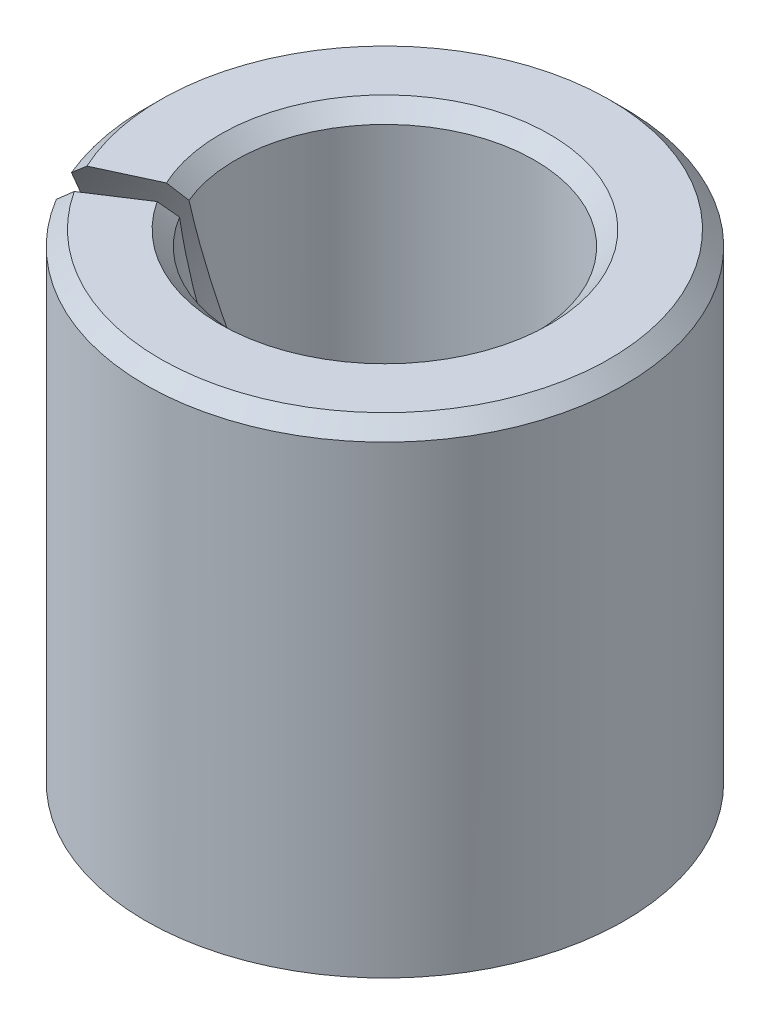
ISO-10303-21;
HEADER;
FILE_DESCRIPTION(('STEP AP214'),'2;1');
FILE_NAME('part.step','',(''),(''),'','','');
FILE_SCHEMA(('AUTOMOTIVE_DESIGN { 1 0 10303 214 1 1 1 1 }'));
ENDSEC;
DATA;
#1=APPLICATION_CONTEXT('core data for automotive mechanical design processes');
#2=APPLICATION_PROTOCOL_DEFINITION('international standard','automotive_design',2000,#1);
#3=PRODUCT_CONTEXT('',#1,'mechanical');
#4=PRODUCT('Part','Part','',(#3));
#5=PRODUCT_RELATED_PRODUCT_CATEGORY('part','',(#4));
#6=PRODUCT_DEFINITION_FORMATION('','',#4);
#7=PRODUCT_DEFINITION_CONTEXT('part definition',#1,'design');
#8=PRODUCT_DEFINITION('design','',#6,#7);
#9=PRODUCT_DEFINITION_SHAPE('','',#8);
#10=(LENGTH_UNIT() NAMED_UNIT(*) SI_UNIT(.MILLI.,.METRE.));
#11=(NAMED_UNIT(*) PLANE_ANGLE_UNIT() SI_UNIT($,.RADIAN.));
#12=(NAMED_UNIT(*) SI_UNIT($,.STERADIAN.) SOLID_ANGLE_UNIT());
#13=UNCERTAINTY_MEASURE_WITH_UNIT(LENGTH_MEASURE(1.E-05),#10,'distance_accuracy_value','');
#14=(GEOMETRIC_REPRESENTATION_CONTEXT(3) GLOBAL_UNCERTAINTY_ASSIGNED_CONTEXT((#13)) GLOBAL_UNIT_ASSIGNED_CONTEXT((#10,
#11,#12)) REPRESENTATION_CONTEXT('',''));
#15=CARTESIAN_POINT('',(0.,0.,0.));
#16=DIRECTION('',(0.,0.,1.));
#17=DIRECTION('',(1.,0.,0.));
#18=AXIS2_PLACEMENT_3D('',#15,#16,#17);
#19=CARTESIAN_POINT('',(0.,8.,0.));
#20=DIRECTION('',(0.,1.,0.));
#21=DIRECTION('',(0.,0.,1.));
#22=AXIS2_PLACEMENT_3D('',#19,#20,#21);
#23=PLANE('',#22);
#24=CARTESIAN_POINT('',(-3.35164731078001,8.,2.18322245869291));
#25=CARTESIAN_POINT('',(-0.837911827695003,8.,0.545805614673228));
#26=B_SPLINE_CURVE_WITH_KNOTS('',1,(#24,#25),.UNSPECIFIED.,.F.,.F.,(2,2),(0.,1.),.UNSPECIFIED.);
#27=CARTESIAN_POINT('',(-2.30425752616126,8.,1.50096544035138));
#28=VERTEX_POINT('',#27);
#29=CARTESIAN_POINT('',(-3.14216935385626,8.,2.04677105502461));
#30=VERTEX_POINT('',#29);
#31=EDGE_CURVE('E145',#28,#30,#26,.F.);
#32=ORIENTED_EDGE('',*,*,#31,.T.);
#33=CARTESIAN_POINT('',(0.,8.,0.));
#34=DIRECTION('',(0.,1.,0.));
#35=DIRECTION('',(0.,0.,1.));
#36=AXIS2_PLACEMENT_3D('',#33,#34,#35);
#37=CIRCLE('',#36,3.75);
#38=CARTESIAN_POINT('',(-3.40389644649981,8.,1.57352755981774));
#39=VERTEX_POINT('',#38);
#40=EDGE_CURVE('E252',#30,#39,#37,.T.);
#41=ORIENTED_EDGE('',*,*,#40,.T.);
#42=CARTESIAN_POINT('',(-0.907705719066615,8.,0.419607349284732));
#43=CARTESIAN_POINT('',(-3.63082287626646,8.,1.67842939713893));
#44=B_SPLINE_CURVE_WITH_KNOTS('',1,(#42,#43),.UNSPECIFIED.,.F.,.F.,(2,2),(0.,1.),.UNSPECIFIED.);
#45=CARTESIAN_POINT('',(-2.49619072743319,8.,1.15392021053301));
#46=VERTEX_POINT('',#45);
#47=EDGE_CURVE('E248',#46,#39,#44,.T.);
#48=ORIENTED_EDGE('',*,*,#47,.F.);
#49=CARTESIAN_POINT('',(0.,8.,0.));
#50=DIRECTION('',(0.,1.,0.));
#51=DIRECTION('',(0.,0.,1.));
#52=AXIS2_PLACEMENT_3D('',#49,#50,#51);
#53=CIRCLE('',#52,2.75);
#54=EDGE_CURVE('E251',#46,#28,#53,.F.);
#55=ORIENTED_EDGE('',*,*,#54,.T.);
#56=EDGE_LOOP('',(#32,#41,#48,#55));
#57=FACE_BOUND('',#56,.T.);
#58=ADVANCED_FACE('F61',(#57),#23,.T.);
#59=CARTESIAN_POINT('',(0.,0.,0.));
#60=DIRECTION('',(0.,1.,0.));
#61=DIRECTION('',(0.,0.,1.));
#62=AXIS2_PLACEMENT_3D('',#59,#60,#61);
#63=PLANE('',#62);
#64=CARTESIAN_POINT('',(0.,0.,0.));
#65=DIRECTION('',(0.,1.,0.));
#66=DIRECTION('',(0.,0.,1.));
#67=AXIS2_PLACEMENT_3D('',#64,#65,#66);
#68=CIRCLE('',#67,2.5);
#69=CARTESIAN_POINT('',(-2.09477956923747,0.,-1.36451403668313));
#70=VERTEX_POINT('',#69);
#71=CARTESIAN_POINT('',(-1.87672931323036,0.,-1.65163164321283));
#72=VERTEX_POINT('',#71);
#73=EDGE_CURVE('E142',#70,#72,#68,.T.);
#74=ORIENTED_EDGE('',*,*,#73,.T.);
#75=CARTESIAN_POINT('',(-3.00276690116857,0.,-2.64261062914053));
#76=CARTESIAN_POINT('',(-0.750691725292143,0.,-0.660652657285132));
#77=B_SPLINE_CURVE_WITH_KNOTS('',1,(#75,#76),.UNSPECIFIED.,.F.,.F.,(2,2),(0.,1.),.UNSPECIFIED.);
#78=CARTESIAN_POINT('',(-3.00276690116857,0.,-2.64261062914053));
#79=VERTEX_POINT('',#78);
#80=EDGE_CURVE('E129',#72,#79,#77,.F.);
#81=ORIENTED_EDGE('',*,*,#80,.T.);
#82=CARTESIAN_POINT('',(0.,0.,0.));
#83=DIRECTION('',(0.,1.,0.));
#84=DIRECTION('',(0.,0.,1.));
#85=AXIS2_PLACEMENT_3D('',#82,#83,#84);
#86=CIRCLE('',#85,4.);
#87=CARTESIAN_POINT('',(-3.35164731077995,0.,-2.18322245869301));
#88=VERTEX_POINT('',#87);
#89=EDGE_CURVE('E136',#88,#79,#86,.T.);
#90=ORIENTED_EDGE('',*,*,#89,.F.);
#91=CARTESIAN_POINT('',(-0.837911827694987,0.,-0.545805614673252));
#92=CARTESIAN_POINT('',(-3.35164731077995,0.,-2.18322245869301));
#93=B_SPLINE_CURVE_WITH_KNOTS('',1,(#91,#92),.UNSPECIFIED.,.F.,.F.,(2,2),(0.,1.),.UNSPECIFIED.);
#94=EDGE_CURVE('E117',#70,#88,#93,.T.);
#95=ORIENTED_EDGE('',*,*,#94,.F.);
#96=EDGE_LOOP('',(#74,#81,#90,#95));
#97=FACE_BOUND('',#96,.T.);
#98=ADVANCED_FACE('F140',(#97),#63,.F.);
#99=CARTESIAN_POINT('',(0.,8.,0.));
#100=DIRECTION('',(0.,-1.,0.));
#101=DIRECTION('',(0.,0.,-1.));
#102=AXIS2_PLACEMENT_3D('',#99,#100,#101);
#103=CYLINDRICAL_SURFACE('',#102,4.);
#104=CARTESIAN_POINT('',(-3.63082287626646,8.,1.67842939713893));
#105=CARTESIAN_POINT('',(-3.95390409081417,6.66638875719981,0.979531566422076));
#106=CARTESIAN_POINT('',(-4.06913133140055,5.33333333333333,0.186447849027548));
#107=CARTESIAN_POINT('',(-3.84767991076001,2.66666666666667,-1.33714318490073));
#108=CARTESIAN_POINT('',(-3.511443556317,1.33361124280019,-2.06460742025553));
#109=CARTESIAN_POINT('',(-3.00276690116857,0.,-2.64261062914053));
#110=B_SPLINE_CURVE_WITH_KNOTS('',3,(#104,#105,#106,#107,#108,#109),.UNSPECIFIED.,.F.,.F.,(4,2,
4),(0.,0.5,1.),.UNSPECIFIED.);
#111=CARTESIAN_POINT('',(-3.68898134344338,7.74999727449896,1.54634180827853));
#112=VERTEX_POINT('',#111);
#113=EDGE_CURVE('E130',#112,#79,#110,.T.);
#114=ORIENTED_EDGE('',*,*,#113,.F.);
#115=CARTESIAN_POINT('',(0.,7.75,0.));
#116=DIRECTION('',(0.,1.,0.));
#117=DIRECTION('',(0.,0.,1.));
#118=AXIS2_PLACEMENT_3D('',#115,#116,#117);
#119=CIRCLE('',#118,4.);
#120=CARTESIAN_POINT('',(-3.42819937983607,7.74999964072157,2.06087490079202));
#121=VERTEX_POINT('',#120);
#122=EDGE_CURVE('E86',#112,#121,#119,.F.);
#123=ORIENTED_EDGE('',*,*,#122,.T.);
#124=CARTESIAN_POINT('',(-3.35164731077995,0.,-2.18322245869301));
#125=CARTESIAN_POINT('',(-3.77189624396996,1.33361124280019,-1.53806318911145));
#126=CARTESIAN_POINT('',(-3.99999999999999,2.66666666666667,-0.769800358919553));
#127=CARTESIAN_POINT('',(-4.00000000000001,5.33333333333333,0.769800358919441));
#128=CARTESIAN_POINT('',(-3.77189624397,6.66638875719981,1.53806318911134));
#129=CARTESIAN_POINT('',(-3.35164731078001,8.,2.18322245869291));
#130=B_SPLINE_CURVE_WITH_KNOTS('',3,(#124,#125,#126,#127,#128,#129),.UNSPECIFIED.,.F.,.F.,(4,2,
4),(0.,0.5,1.),.UNSPECIFIED.);
#131=EDGE_CURVE('E120',#88,#121,#130,.T.);
#132=ORIENTED_EDGE('',*,*,#131,.F.);
#133=ORIENTED_EDGE('',*,*,#89,.T.);
#134=EDGE_LOOP('',(#114,#123,#132,#133));
#135=FACE_BOUND('',#134,.T.);
#136=ADVANCED_FACE('F135',(#135),#103,.T.);
#137=CARTESIAN_POINT('',(0.,8.,0.));
#138=DIRECTION('',(0.,-1.,0.));
#139=DIRECTION('',(0.,0.,-1.));
#140=AXIS2_PLACEMENT_3D('',#137,#138,#139);
#141=CYLINDRICAL_SURFACE('',#140,2.5);
#142=CARTESIAN_POINT('',(-2.0947795692375,8.,1.36451403668308));
#143=CARTESIAN_POINT('',(-2.13347179879048,7.80356652144109,1.30512649417586));
#144=CARTESIAN_POINT('',(-2.16962311571061,7.60713145407747,1.24409292330248));
#145=CARTESIAN_POINT('',(-2.23661725477523,7.21426337951584,1.11917722608871));
#146=CARTESIAN_POINT('',(-2.26746011576004,7.01783037231328,1.05529512059447));
#147=CARTESIAN_POINT('',(-2.32360215913504,6.62503235946273,0.925146039305551));
#148=CARTESIAN_POINT('',(-2.34890313260462,6.42866735238332,0.85887984210905));
#149=CARTESIAN_POINT('',(-2.39378787923158,6.03594562568108,0.724433761287841));
#150=CARTESIAN_POINT('',(-2.4133716504838,5.83958890606105,0.656253877025438));
#151=CARTESIAN_POINT('',(-2.4633177761066,5.25047542796568,0.449595958062258));
#152=CARTESIAN_POINT('',(-2.48487465652168,4.85767732675557,0.30900032229986));
#153=CARTESIAN_POINT('',(-2.50387752929466,4.07204467027626,0.026188622695644));
#154=CARTESIAN_POINT('',(-2.50132092214377,3.67921011564217,-0.116027614201374));
#155=CARTESIAN_POINT('',(-2.47660302648175,3.01264415277902,-0.35525504392761));
#156=CARTESIAN_POINT('',(-2.4606180958924,2.73889822513671,-0.452903883422451));
#157=CARTESIAN_POINT('',(-2.4172040175585,2.19139317228649,-0.64566401592916));
#158=CARTESIAN_POINT('',(-2.38977413216883,1.91763404736533,-0.740775144961189));
#159=CARTESIAN_POINT('',(-2.32383215830161,1.36989349168112,-0.927132446653661));
#160=CARTESIAN_POINT('',(-2.28531136574192,1.09591205550952,-1.01837551891094));
#161=CARTESIAN_POINT('',(-2.19777353235584,0.547954199173697,-1.19565921328491));
#162=CARTESIAN_POINT('',(-2.1487568676172,0.273977779181426,-1.28170002166732));
#163=CARTESIAN_POINT('',(-2.09477956923747,0.,-1.36451403668313));
#164=B_SPLINE_CURVE_WITH_KNOTS('',3,(#142,#143,#144,#145,#146,#147,#148,#149,#150,#151,#152,
#153,#154,#155,#156,#157,#158,#159,#160,#161,#162,#163),.UNSPECIFIED.,.F.,.F.,(4,2,2,2,2,2,2,2,
2,2,4),(0.,0.626466994763436,1.25292940566824,1.8791890508341,2.50544890468958,3.75797491757595,
5.01063595819591,5.88365662154139,6.75673356111809,7.6304975630143,8.50423026146536),.UNSPECIFIED.);
#165=CARTESIAN_POINT('',(-2.14264116350322,7.75,1.28805622721276));
#166=VERTEX_POINT('',#165);
#167=EDGE_CURVE('E123',#166,#70,#164,.T.);
#168=ORIENTED_EDGE('',*,*,#167,.F.);
#169=CARTESIAN_POINT('',(0.,7.75,0.));
#170=DIRECTION('',(0.,1.,0.));
#171=DIRECTION('',(0.,0.,1.));
#172=AXIS2_PLACEMENT_3D('',#169,#170,#171);
#173=CIRCLE('',#172,2.5);
#174=CARTESIAN_POINT('',(-2.30563074301679,7.75,0.966471353355011));
#175=VERTEX_POINT('',#174);
#176=EDGE_CURVE('E13',#166,#175,#173,.T.);
#177=ORIENTED_EDGE('',*,*,#176,.T.);
#178=CARTESIAN_POINT('',(-1.87672931323035,0.,-1.65163164321291));
#179=CARTESIAN_POINT('',(-1.92356131899051,0.196433478558899,-1.59842701870233));
#180=CARTESIAN_POINT('',(-1.96811559368399,0.392868545922516,-1.54322800516808));
#181=CARTESIAN_POINT('',(-2.05238057661736,0.78573662048414,-1.42924748608409));
#182=CARTESIAN_POINT('',(-2.09209132029522,0.982169627686704,-1.37046600675041));
#183=CARTESIAN_POINT('',(-2.16636980791478,1.37496764053726,-1.24974559144454));
#184=CARTESIAN_POINT('',(-2.20093921231998,1.57133264761667,-1.18780768359754));
#185=CARTESIAN_POINT('',(-2.26469553042314,1.9640543743189,-1.06121573665825));
#186=CARTESIAN_POINT('',(-2.29388244232746,2.16041109393894,-0.996561696660875));
#187=CARTESIAN_POINT('',(-2.37303423636561,2.7495245720343,-0.799236826369612));
#188=CARTESIAN_POINT('',(-2.4145897983071,3.14232267324441,-0.663203862863005));
#189=CARTESIAN_POINT('',(-2.47407383086553,3.92795532972372,-0.386066322141364));
#190=CARTESIAN_POINT('',(-2.49199975389665,4.32078988435781,-0.244961199765332));
#191=CARTESIAN_POINT('',(-2.50194862556406,4.98735584722096,-0.0046660532227408));
#192=CARTESIAN_POINT('',(-2.50017542380971,5.26110177486328,0.094266598698524));
#193=CARTESIAN_POINT('',(-2.4849388140592,5.8086068277135,0.291266843888466));
#194=CARTESIAN_POINT('',(-2.47147465250205,6.08236595263466,0.389334380983062));
#195=CARTESIAN_POINT('',(-2.43302344222969,6.63010650831887,0.583238718841184));
#196=CARTESIAN_POINT('',(-2.40802733399015,6.90408794449047,0.679073703409717));
#197=CARTESIAN_POINT('',(-2.34689971108731,7.4520458008263,0.867105068567393));
#198=CARTESIAN_POINT('',(-2.31076859539285,7.72602222081857,0.959301579390057));
#199=CARTESIAN_POINT('',(-2.26926429766654,8.,1.04901837321183));
#200=B_SPLINE_CURVE_WITH_KNOTS('',3,(#178,#179,#180,#181,#182,#183,#184,#185,#186,#187,#188,
#189,#190,#191,#192,#193,#194,#195,#196,#197,#198,#199),.UNSPECIFIED.,.F.,.F.,(4,2,2,2,2,2,2,2,
2,2,4),(0.,0.626466994763436,1.25292940566825,1.87918905083411,2.50544890468958,
3.75797491757595,5.01063595819591,5.8836566215414,6.75673356111811,7.63049756301431,
8.50423026146538),.UNSPECIFIED.);
#201=EDGE_CURVE('E143',#72,#175,#200,.T.);
#202=ORIENTED_EDGE('',*,*,#201,.F.);
#203=ORIENTED_EDGE('',*,*,#73,.F.);
#204=EDGE_LOOP('',(#168,#177,#202,#203));
#205=FACE_BOUND('',#204,.T.);
#206=ADVANCED_FACE('F159',(#205),#141,.F.);
#207=CARTESIAN_POINT('',(-3.35164731077995,0.,-2.18322245869301));
#208=CARTESIAN_POINT('',(-3.77189624396996,1.33361124280019,-1.53806318911145));
#209=CARTESIAN_POINT('',(-3.99999999999999,2.66666666666667,-0.769800358919553));
#210=CARTESIAN_POINT('',(-4.00000000000001,5.33333333333333,0.769800358919441));
#211=CARTESIAN_POINT('',(-3.77189624397,6.66638875719981,1.53806318911134));
#212=CARTESIAN_POINT('',(-3.35164731078001,8.,2.18322245869291));
#213=CARTESIAN_POINT('',(-0.837911827694987,0.,-0.545805614673252));
#214=CARTESIAN_POINT('',(-0.942953954461154,1.33335601982042,-0.384546664494995));
#215=CARTESIAN_POINT('',(-0.999999999999997,2.66666666666667,-0.192450089729888));
#216=CARTESIAN_POINT('',(-1.,5.33333333333333,0.19245008972986));
#217=CARTESIAN_POINT('',(-0.942953954461165,6.66664398017957,0.384546664494968));
#218=CARTESIAN_POINT('',(-0.837911827695003,8.,0.545805614673228));
#219=B_SPLINE_SURFACE_WITH_KNOTS('',1,3,((#207,#208,#209,#210,#211,#212),(#213,#214,#215,#216,
#217,#218)),.UNSPECIFIED.,.F.,.F.,.F.,(2,2),(4,2,4),(0.,1.),(0.,0.5,1.),.UNSPECIFIED.);
#220=CARTESIAN_POINT('',(-3.42822573173537,7.7499968609573,2.06089627216386));
#221=CARTESIAN_POINT('',(-3.38031686553513,7.79148275615796,2.06004793054373));
#222=CARTESIAN_POINT('',(-3.33252440094507,7.83305929867851,2.05844665830539));
#223=CARTESIAN_POINT('',(-3.23717227498537,7.91639367835941,2.05373825259231));
#224=CARTESIAN_POINT('',(-3.18961261361571,7.95815151551976,2.05063111911756));
#225=CARTESIAN_POINT('',(-3.14216935385626,8.,2.0467710550246));
#226=B_SPLINE_CURVE_WITH_KNOTS('',3,(#220,#221,#222,#223,#224,#225),.UNSPECIFIED.,.F.,.F.,(4,2,
4),(0.,0.190099010231576,0.380198020463151),.UNSPECIFIED.);
#227=EDGE_CURVE('E71',#121,#30,#226,.T.);
#228=CARTESIAN_POINT('',(-2.30425752616126,8.,1.50096544035138));
#229=CARTESIAN_POINT('',(-2.27844725463691,7.95846642167605,1.46446972751754));
#230=CARTESIAN_POINT('',(-2.25207408865323,7.91686629918075,1.42847943667241));
#231=CARTESIAN_POINT('',(-2.19820196776722,7.83353296584742,1.35750969895953));
#232=CARTESIAN_POINT('',(-2.17070301286488,7.79179975500939,1.32253025209179));
#233=CARTESIAN_POINT('',(-2.14264116350322,7.75,1.28805622721276));
#234=B_SPLINE_CURVE_WITH_KNOTS('',3,(#228,#229,#230,#231,#232,#233),.UNSPECIFIED.,.F.,.F.,(4,2,
4),(0.,0.183010207356589,0.366020414713178),.UNSPECIFIED.);
#235=EDGE_CURVE('E78',#28,#166,#234,.T.);
#236=ORIENTED_EDGE('',*,*,#131,.T.);
#237=ORIENTED_EDGE('',*,*,#227,.T.);
#238=ORIENTED_EDGE('',*,*,#31,.F.);
#239=ORIENTED_EDGE('',*,*,#235,.T.);
#240=ORIENTED_EDGE('',*,*,#167,.T.);
#241=ORIENTED_EDGE('',*,*,#94,.T.);
#242=EDGE_LOOP('',(#236,#237,#238,#239,#240,#241));
#243=FACE_BOUND('',#242,.T.);
#244=ADVANCED_FACE('F119',(#243),#219,.F.);
#245=CARTESIAN_POINT('',(-3.63082287626646,8.,1.67842939713893));
#246=CARTESIAN_POINT('',(-3.95390409081417,6.66638875719981,0.979531566422076));
#247=CARTESIAN_POINT('',(-4.06913133140055,5.33333333333333,0.186447849027548));
#248=CARTESIAN_POINT('',(-3.84767991076001,2.66666666666667,-1.33714318490073));
#249=CARTESIAN_POINT('',(-3.511443556317,1.33361124280019,-2.06460742025553));
#250=CARTESIAN_POINT('',(-3.00276690116857,0.,-2.64261062914053));
#251=CARTESIAN_POINT('',(-0.907705719066615,8.,0.419607349284732));
#252=CARTESIAN_POINT('',(-0.988460565097227,6.66664398017958,0.244916329908448));
#253=CARTESIAN_POINT('',(-1.01728283285014,5.33333333333333,0.0466119622568872));
#254=CARTESIAN_POINT('',(-0.961919977690001,2.66666666666667,-0.334285796225182));
#255=CARTESIAN_POINT('',(-0.877836551782236,1.33335601982042,-0.516179509243854));
#256=CARTESIAN_POINT('',(-0.750691725292143,0.,-0.660652657285132));
#257=B_SPLINE_SURFACE_WITH_KNOTS('',1,3,((#245,#246,#247,#248,#249,#250),(#251,#252,#253,#254,
#255,#256)),.UNSPECIFIED.,.F.,.F.,.F.,(2,2),(4,2,4),(0.,1.),(0.,0.5,1.),.UNSPECIFIED.);
#258=CARTESIAN_POINT('',(-3.40389644649981,8.,1.57352755981774));
#259=CARTESIAN_POINT('',(-3.45140158274685,7.95815151551976,1.57052339245308));
#260=CARTESIAN_POINT('',(-3.49891361097209,7.91639367835941,1.56675738104183));
#261=CARTESIAN_POINT('',(-3.59395145137899,7.83305929867851,1.55770167012616));
#262=CARTESIAN_POINT('',(-3.64147726356064,7.79148275615795,1.55241197062173));
#263=CARTESIAN_POINT('',(-3.68900996772049,7.74999686095729,1.54636042707072));
#264=B_SPLINE_CURVE_WITH_KNOTS('',3,(#258,#259,#260,#261,#262,#263),.UNSPECIFIED.,.F.,.F.,(4,2,
4),(0.,0.190099010231579,0.380198020463157),.UNSPECIFIED.);
#265=EDGE_CURVE('E205',#39,#112,#264,.T.);
#266=CARTESIAN_POINT('',(-2.30563074301679,7.75,0.966471353355011));
#267=CARTESIAN_POINT('',(-2.3383594260342,7.79179975500939,0.996550566923566));
#268=CARTESIAN_POINT('',(-2.37060376624427,7.83353296584742,1.02721091180601));
#269=CARTESIAN_POINT('',(-2.43412376104974,7.91686629918075,1.08969386419868));
#270=CARTESIAN_POINT('',(-2.46539941564514,7.95846642167605,1.1215164717089));
#271=CARTESIAN_POINT('',(-2.4961907274332,8.,1.15392021053302));
#272=B_SPLINE_CURVE_WITH_KNOTS('',3,(#266,#267,#268,#269,#270,#271),.UNSPECIFIED.,.F.,.F.,(4,2,
4),(0.,0.183010207356592,0.366020414713182),.UNSPECIFIED.);
#273=EDGE_CURVE('E203',#175,#46,#272,.T.);
#274=ORIENTED_EDGE('',*,*,#47,.T.);
#275=ORIENTED_EDGE('',*,*,#265,.T.);
#276=ORIENTED_EDGE('',*,*,#113,.T.);
#277=ORIENTED_EDGE('',*,*,#80,.F.);
#278=ORIENTED_EDGE('',*,*,#201,.T.);
#279=ORIENTED_EDGE('',*,*,#273,.T.);
#280=EDGE_LOOP('',(#274,#275,#276,#277,#278,#279));
#281=FACE_BOUND('',#280,.T.);
#282=ADVANCED_FACE('F163',(#281),#257,.F.);
#283=CARTESIAN_POINT('',(0.,8.,0.));
#284=DIRECTION('',(0.,-1.,0.));
#285=DIRECTION('',(0.,0.,-1.));
#286=AXIS2_PLACEMENT_3D('',#283,#284,#285);
#287=CONICAL_SURFACE('',#286,3.75,0.785398163397442);
#288=ORIENTED_EDGE('',*,*,#227,.F.);
#289=ORIENTED_EDGE('',*,*,#122,.F.);
#290=ORIENTED_EDGE('',*,*,#265,.F.);
#291=ORIENTED_EDGE('',*,*,#40,.F.);
#292=EDGE_LOOP('',(#288,#289,#290,#291));
#293=FACE_BOUND('',#292,.T.);
#294=ADVANCED_FACE('F168',(#293),#287,.T.);
#295=CARTESIAN_POINT('',(0.,7.75,0.));
#296=DIRECTION('',(0.,1.,0.));
#297=DIRECTION('',(0.,0.,1.));
#298=AXIS2_PLACEMENT_3D('',#295,#296,#297);
#299=CONICAL_SURFACE('',#298,2.5,0.785398163397455);
#300=ORIENTED_EDGE('',*,*,#235,.F.);
#301=ORIENTED_EDGE('',*,*,#54,.F.);
#302=ORIENTED_EDGE('',*,*,#273,.F.);
#303=ORIENTED_EDGE('',*,*,#176,.F.);
#304=EDGE_LOOP('',(#300,#301,#302,#303));
#305=FACE_BOUND('',#304,.T.);
#306=ADVANCED_FACE('F64',(#305),#299,.F.);
#307=CLOSED_SHELL('',(#58,#98,#136,#206,#244,#282,#294,#306));
#308=MANIFOLD_SOLID_BREP('B2',#307);
#309=ADVANCED_BREP_SHAPE_REPRESENTATION('',(#18,#308),#14);
#310=SHAPE_DEFINITION_REPRESENTATION(#9,#309);
ENDSEC;
END-ISO-10303-21;
